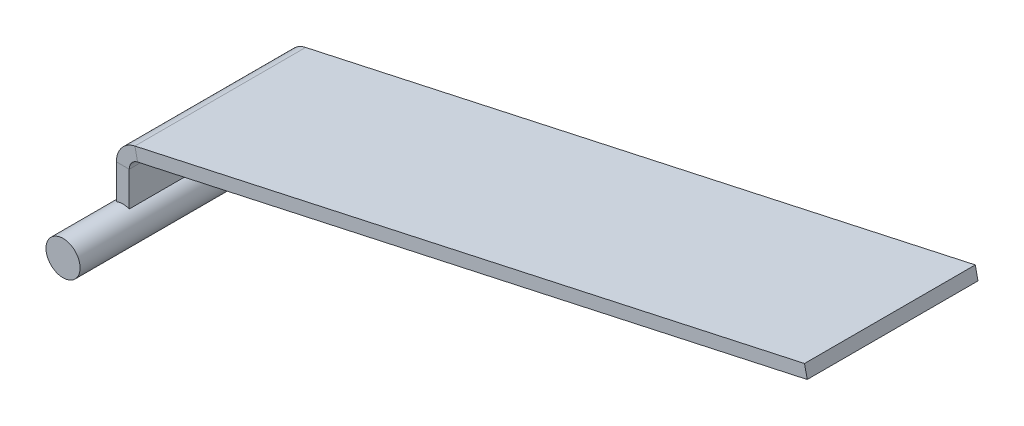
ISO-10303-21;
HEADER;
FILE_DESCRIPTION(('STEP AP214'),'2;1');
FILE_NAME('part.step','',(''),(''),'','','');
FILE_SCHEMA(('AUTOMOTIVE_DESIGN { 1 0 10303 214 1 1 1 1 }'));
ENDSEC;
DATA;
#1=APPLICATION_CONTEXT('core data for automotive mechanical design processes');
#2=APPLICATION_PROTOCOL_DEFINITION('international standard','automotive_design',2000,#1);
#3=PRODUCT_CONTEXT('',#1,'mechanical');
#4=PRODUCT('Part','Part','',(#3));
#5=PRODUCT_RELATED_PRODUCT_CATEGORY('part','',(#4));
#6=PRODUCT_DEFINITION_FORMATION('','',#4);
#7=PRODUCT_DEFINITION_CONTEXT('part definition',#1,'design');
#8=PRODUCT_DEFINITION('design','',#6,#7);
#9=PRODUCT_DEFINITION_SHAPE('','',#8);
#10=(LENGTH_UNIT() NAMED_UNIT(*) SI_UNIT(.MILLI.,.METRE.));
#11=(NAMED_UNIT(*) PLANE_ANGLE_UNIT() SI_UNIT($,.RADIAN.));
#12=(NAMED_UNIT(*) SI_UNIT($,.STERADIAN.) SOLID_ANGLE_UNIT());
#13=UNCERTAINTY_MEASURE_WITH_UNIT(LENGTH_MEASURE(1.E-05),#10,'distance_accuracy_value','');
#14=(GEOMETRIC_REPRESENTATION_CONTEXT(3) GLOBAL_UNCERTAINTY_ASSIGNED_CONTEXT((#13)) GLOBAL_UNIT_ASSIGNED_CONTEXT((#10,
#11,#12)) REPRESENTATION_CONTEXT('',''));
#15=CARTESIAN_POINT('',(0.,0.,0.));
#16=DIRECTION('',(0.,0.,1.));
#17=DIRECTION('',(1.,0.,0.));
#18=AXIS2_PLACEMENT_3D('',#15,#16,#17);
#19=CARTESIAN_POINT('',(-0.15,0.,-2.));
#20=DIRECTION('',(-1.,0.,0.));
#21=DIRECTION('',(0.,0.,1.));
#22=AXIS2_PLACEMENT_3D('',#19,#20,#21);
#23=PLANE('',#22);
#24=DIRECTION('',(0.,1.,0.));
#25=VECTOR('',#24,1.);
#26=CARTESIAN_POINT('',(-0.15,0.,-2.));
#27=LINE('',#26,#25);
#28=CARTESIAN_POINT('',(-0.15,0.370809924354783,-2.));
#29=VERTEX_POINT('',#28);
#30=CARTESIAN_POINT('',(-0.15,1.17804151614602,-2.));
#31=VERTEX_POINT('',#30);
#32=EDGE_CURVE('E200',#29,#31,#27,.T.);
#33=ORIENTED_EDGE('',*,*,#32,.F.);
#34=DIRECTION('',(0.,0.,-1.));
#35=VECTOR('',#34,1.);
#36=CARTESIAN_POINT('',(-0.15,0.370809924354783,3.4));
#37=LINE('',#36,#35);
#38=CARTESIAN_POINT('',(-0.15,0.370809924354783,2.));
#39=VERTEX_POINT('',#38);
#40=EDGE_CURVE('E54',#29,#39,#37,.F.);
#41=ORIENTED_EDGE('',*,*,#40,.T.);
#42=DIRECTION('',(0.,1.,0.));
#43=VECTOR('',#42,1.);
#44=CARTESIAN_POINT('',(-0.15,0.,2.));
#45=LINE('',#44,#43);
#46=CARTESIAN_POINT('',(-0.15,1.17804151614602,2.));
#47=VERTEX_POINT('',#46);
#48=EDGE_CURVE('E165',#39,#47,#45,.T.);
#49=ORIENTED_EDGE('',*,*,#48,.T.);
#50=DIRECTION('',(0.,0.,1.));
#51=VECTOR('',#50,1.);
#52=CARTESIAN_POINT('',(-0.15,1.17804151614602,-2.));
#53=LINE('',#52,#51);
#54=EDGE_CURVE('E196',#31,#47,#53,.T.);
#55=ORIENTED_EDGE('',*,*,#54,.F.);
#56=EDGE_LOOP('',(#33,#41,#49,#55));
#57=FACE_BOUND('',#56,.T.);
#58=ADVANCED_FACE('F39',(#57),#23,.T.);
#59=CARTESIAN_POINT('',(0.15,0.,-2.));
#60=DIRECTION('',(1.,0.,0.));
#61=DIRECTION('',(0.,0.,-1.));
#62=AXIS2_PLACEMENT_3D('',#59,#60,#61);
#63=PLANE('',#62);
#64=DIRECTION('',(0.,1.,0.));
#65=VECTOR('',#64,1.);
#66=CARTESIAN_POINT('',(0.15,0.,2.));
#67=LINE('',#66,#65);
#68=CARTESIAN_POINT('',(0.15,0.370809924354783,2.));
#69=VERTEX_POINT('',#68);
#70=CARTESIAN_POINT('',(0.15,1.17804151614602,2.));
#71=VERTEX_POINT('',#70);
#72=EDGE_CURVE('E114',#69,#71,#67,.T.);
#73=ORIENTED_EDGE('',*,*,#72,.F.);
#74=DIRECTION('',(0.,0.,-1.));
#75=VECTOR('',#74,1.);
#76=CARTESIAN_POINT('',(0.15,0.370809924354783,3.4));
#77=LINE('',#76,#75);
#78=CARTESIAN_POINT('',(0.15,0.370809924354783,-2.));
#79=VERTEX_POINT('',#78);
#80=EDGE_CURVE('E103',#69,#79,#77,.T.);
#81=ORIENTED_EDGE('',*,*,#80,.T.);
#82=DIRECTION('',(0.,1.,0.));
#83=VECTOR('',#82,1.);
#84=CARTESIAN_POINT('',(0.15,0.,-2.));
#85=LINE('',#84,#83);
#86=CARTESIAN_POINT('',(0.15,1.17804151614602,-2.));
#87=VERTEX_POINT('',#86);
#88=EDGE_CURVE('E112',#79,#87,#85,.T.);
#89=ORIENTED_EDGE('',*,*,#88,.T.);
#90=DIRECTION('',(0.,0.,-1.));
#91=VECTOR('',#90,1.);
#92=CARTESIAN_POINT('',(0.15,1.17804151614602,-2.));
#93=LINE('',#92,#91);
#94=EDGE_CURVE('E123',#71,#87,#93,.T.);
#95=ORIENTED_EDGE('',*,*,#94,.F.);
#96=EDGE_LOOP('',(#73,#81,#89,#95));
#97=FACE_BOUND('',#96,.T.);
#98=ADVANCED_FACE('F110',(#97),#63,.T.);
#99=CARTESIAN_POINT('',(16.,5.,0.));
#100=DIRECTION('',(0.976900017396262,0.213696878805432,0.));
#101=DIRECTION('',(0.,0.,1.));
#102=AXIS2_PLACEMENT_3D('',#99,#100,#101);
#103=PLANE('',#102);
#104=DIRECTION('',(0.,0.,-1.));
#105=VECTOR('',#104,1.);
#106=CARTESIAN_POINT('',(16.0320545318208,4.85346499739056,-2.));
#107=LINE('',#106,#105);
#108=CARTESIAN_POINT('',(16.0320545318208,4.85346499739056,2.));
#109=VERTEX_POINT('',#108);
#110=CARTESIAN_POINT('',(16.0320545318208,4.85346499739056,-2.));
#111=VERTEX_POINT('',#110);
#112=EDGE_CURVE('E61',#109,#111,#107,.T.);
#113=ORIENTED_EDGE('',*,*,#112,.T.);
#114=DIRECTION('',(-0.213696878805432,0.976900017396262,0.));
#115=VECTOR('',#114,1.);
#116=CARTESIAN_POINT('',(15.9679454681792,5.14653500260944,-2.));
#117=LINE('',#116,#115);
#118=CARTESIAN_POINT('',(15.9679454681792,5.14653500260944,-2.));
#119=VERTEX_POINT('',#118);
#120=EDGE_CURVE('E47',#111,#119,#117,.T.);
#121=ORIENTED_EDGE('',*,*,#120,.T.);
#122=DIRECTION('',(0.,0.,1.));
#123=VECTOR('',#122,1.);
#124=CARTESIAN_POINT('',(15.9679454681792,5.14653500260944,-2.));
#125=LINE('',#124,#123);
#126=CARTESIAN_POINT('',(15.9679454681792,5.14653500260944,2.));
#127=VERTEX_POINT('',#126);
#128=EDGE_CURVE('E146',#119,#127,#125,.T.);
#129=ORIENTED_EDGE('',*,*,#128,.T.);
#130=DIRECTION('',(0.213696878805432,-0.976900017396262,0.));
#131=VECTOR('',#130,1.);
#132=CARTESIAN_POINT('',(15.9679454681792,5.14653500260944,2.));
#133=LINE('',#132,#131);
#134=EDGE_CURVE('E173',#127,#109,#133,.T.);
#135=ORIENTED_EDGE('',*,*,#134,.T.);
#136=EDGE_LOOP('',(#113,#121,#129,#135));
#137=FACE_BOUND('',#136,.T.);
#138=ADVANCED_FACE('F41',(#137),#103,.T.);
#139=CARTESIAN_POINT('',(-0.15,0.,2.));
#140=DIRECTION('',(0.,0.,1.));
#141=DIRECTION('',(1.,0.,0.));
#142=AXIS2_PLACEMENT_3D('',#139,#140,#141);
#143=PLANE('',#142);
#144=ORIENTED_EDGE('',*,*,#48,.F.);
#145=CARTESIAN_POINT('',(0.,0.,2.));
#146=DIRECTION('',(0.,0.,1.));
#147=DIRECTION('',(1.,0.,0.));
#148=AXIS2_PLACEMENT_3D('',#145,#146,#147);
#149=CIRCLE('',#148,0.4);
#150=EDGE_CURVE('E115',#39,#69,#149,.F.);
#151=ORIENTED_EDGE('',*,*,#150,.T.);
#152=ORIENTED_EDGE('',*,*,#72,.T.);
#153=DIRECTION('',(1.,0.,0.));
#154=VECTOR('',#153,1.);
#155=CARTESIAN_POINT('',(-0.15,1.17804151614602,2.));
#156=LINE('',#155,#154);
#157=EDGE_CURVE('E162',#47,#71,#156,.T.);
#158=ORIENTED_EDGE('',*,*,#157,.F.);
#159=EDGE_LOOP('',(#144,#151,#152,#158));
#160=FACE_BOUND('',#159,.T.);
#161=ADVANCED_FACE('F192',(#160),#143,.T.);
#162=CARTESIAN_POINT('',(-0.15,0.,-2.));
#163=DIRECTION('',(0.,0.,-1.));
#164=DIRECTION('',(-1.,0.,0.));
#165=AXIS2_PLACEMENT_3D('',#162,#163,#164);
#166=PLANE('',#165);
#167=ORIENTED_EDGE('',*,*,#88,.F.);
#168=CARTESIAN_POINT('',(0.,0.,-2.));
#169=DIRECTION('',(0.,0.,-1.));
#170=DIRECTION('',(-1.,0.,0.));
#171=AXIS2_PLACEMENT_3D('',#168,#169,#170);
#172=CIRCLE('',#171,0.4);
#173=EDGE_CURVE('E11',#79,#29,#172,.F.);
#174=ORIENTED_EDGE('',*,*,#173,.T.);
#175=ORIENTED_EDGE('',*,*,#32,.T.);
#176=DIRECTION('',(-1.,0.,0.));
#177=VECTOR('',#176,1.);
#178=CARTESIAN_POINT('',(-0.15,1.17804151614602,-2.));
#179=LINE('',#178,#177);
#180=EDGE_CURVE('E121',#87,#31,#179,.T.);
#181=ORIENTED_EDGE('',*,*,#180,.F.);
#182=EDGE_LOOP('',(#167,#174,#175,#181));
#183=FACE_BOUND('',#182,.T.);
#184=ADVANCED_FACE('F119',(#183),#166,.T.);
#185=CARTESIAN_POINT('',(0.4,1.17804151614602,0.));
#186=DIRECTION('',(0.,0.,-1.));
#187=DIRECTION('',(-1.,0.,0.));
#188=AXIS2_PLACEMENT_3D('',#185,#186,#187);
#189=CYLINDRICAL_SURFACE('',#188,0.55);
#190=CARTESIAN_POINT('',(0.4,1.17804151614602,2.));
#191=DIRECTION('',(0.,0.,-1.));
#192=DIRECTION('',(-1.,0.,0.));
#193=AXIS2_PLACEMENT_3D('',#190,#191,#192);
#194=CIRCLE('',#193,0.55);
#195=CARTESIAN_POINT('',(0.282466716657016,1.71533652571396,2.));
#196=VERTEX_POINT('',#195);
#197=EDGE_CURVE('E170',#47,#196,#194,.T.);
#198=ORIENTED_EDGE('',*,*,#197,.T.);
#199=DIRECTION('',(0.,0.,1.));
#200=VECTOR('',#199,1.);
#201=CARTESIAN_POINT('',(0.282466716657016,1.71533652571396,-2.));
#202=LINE('',#201,#200);
#203=CARTESIAN_POINT('',(0.282466716657016,1.71533652571396,-2.));
#204=VERTEX_POINT('',#203);
#205=EDGE_CURVE('E207',#204,#196,#202,.T.);
#206=ORIENTED_EDGE('',*,*,#205,.F.);
#207=CARTESIAN_POINT('',(0.4,1.17804151614602,-2.));
#208=DIRECTION('',(0.,0.,-1.));
#209=DIRECTION('',(-1.,0.,0.));
#210=AXIS2_PLACEMENT_3D('',#207,#208,#209);
#211=CIRCLE('',#210,0.55);
#212=EDGE_CURVE('E125',#31,#204,#211,.T.);
#213=ORIENTED_EDGE('',*,*,#212,.F.);
#214=ORIENTED_EDGE('',*,*,#54,.T.);
#215=EDGE_LOOP('',(#198,#206,#213,#214));
#216=FACE_BOUND('',#215,.T.);
#217=ADVANCED_FACE('F197',(#216),#189,.T.);
#218=CARTESIAN_POINT('',(-0.15,1.17804151614602,2.));
#219=DIRECTION('',(0.,0.,1.));
#220=DIRECTION('',(1.,0.,0.));
#221=AXIS2_PLACEMENT_3D('',#218,#219,#220);
#222=PLANE('',#221);
#223=CARTESIAN_POINT('',(0.4,1.17804151614602,2.));
#224=DIRECTION('',(0.,0.,-1.));
#225=DIRECTION('',(-1.,0.,0.));
#226=AXIS2_PLACEMENT_3D('',#223,#224,#225);
#227=CIRCLE('',#226,0.25);
#228=CARTESIAN_POINT('',(0.346575780298644,1.42226652049509,2.));
#229=VERTEX_POINT('',#228);
#230=EDGE_CURVE('E134',#71,#229,#227,.T.);
#231=ORIENTED_EDGE('',*,*,#230,.T.);
#232=DIRECTION('',(0.213696878805426,-0.976900017396263,0.));
#233=VECTOR('',#232,1.);
#234=CARTESIAN_POINT('',(0.282466716657016,1.71533652571396,2.));
#235=LINE('',#234,#233);
#236=EDGE_CURVE('E167',#196,#229,#235,.T.);
#237=ORIENTED_EDGE('',*,*,#236,.F.);
#238=ORIENTED_EDGE('',*,*,#197,.F.);
#239=ORIENTED_EDGE('',*,*,#157,.T.);
#240=EDGE_LOOP('',(#231,#237,#238,#239));
#241=FACE_BOUND('',#240,.T.);
#242=ADVANCED_FACE('F185',(#241),#222,.T.);
#243=CARTESIAN_POINT('',(0.4,1.17804151614602,0.));
#244=DIRECTION('',(0.,0.,-1.));
#245=DIRECTION('',(-1.,0.,0.));
#246=AXIS2_PLACEMENT_3D('',#243,#244,#245);
#247=CYLINDRICAL_SURFACE('',#246,0.25);
#248=CARTESIAN_POINT('',(0.4,1.17804151614602,-2.));
#249=DIRECTION('',(0.,0.,-1.));
#250=DIRECTION('',(-1.,0.,0.));
#251=AXIS2_PLACEMENT_3D('',#248,#249,#250);
#252=CIRCLE('',#251,0.25);
#253=CARTESIAN_POINT('',(0.346575780298643,1.42226652049509,-2.));
#254=VERTEX_POINT('',#253);
#255=EDGE_CURVE('E133',#87,#254,#252,.T.);
#256=ORIENTED_EDGE('',*,*,#255,.T.);
#257=DIRECTION('',(0.,0.,-1.));
#258=VECTOR('',#257,1.);
#259=CARTESIAN_POINT('',(0.346575780298643,1.42226652049509,-2.));
#260=LINE('',#259,#258);
#261=EDGE_CURVE('E130',#229,#254,#260,.T.);
#262=ORIENTED_EDGE('',*,*,#261,.F.);
#263=ORIENTED_EDGE('',*,*,#230,.F.);
#264=ORIENTED_EDGE('',*,*,#94,.T.);
#265=EDGE_LOOP('',(#256,#262,#263,#264));
#266=FACE_BOUND('',#265,.T.);
#267=ADVANCED_FACE('F183',(#266),#247,.F.);
#268=CARTESIAN_POINT('',(-0.15,1.17804151614602,-2.));
#269=DIRECTION('',(0.,0.,-1.));
#270=DIRECTION('',(-1.,0.,0.));
#271=AXIS2_PLACEMENT_3D('',#268,#269,#270);
#272=PLANE('',#271);
#273=DIRECTION('',(-0.213696878805426,0.976900017396263,0.));
#274=VECTOR('',#273,1.);
#275=CARTESIAN_POINT('',(0.282466716657016,1.71533652571396,-2.));
#276=LINE('',#275,#274);
#277=EDGE_CURVE('E137',#254,#204,#276,.T.);
#278=ORIENTED_EDGE('',*,*,#277,.F.);
#279=ORIENTED_EDGE('',*,*,#255,.F.);
#280=ORIENTED_EDGE('',*,*,#180,.T.);
#281=ORIENTED_EDGE('',*,*,#212,.T.);
#282=EDGE_LOOP('',(#278,#279,#280,#281));
#283=FACE_BOUND('',#282,.T.);
#284=ADVANCED_FACE('F211',(#283),#272,.T.);
#285=CARTESIAN_POINT('',(0.282466716657015,1.71533652571396,-2.));
#286=DIRECTION('',(-0.213696878805432,0.976900017396262,0.));
#287=DIRECTION('',(-0.976900017396262,-0.213696878805432,0.));
#288=AXIS2_PLACEMENT_3D('',#285,#286,#287);
#289=PLANE('',#288);
#290=DIRECTION('',(0.976900017396262,0.213696878805432,0.));
#291=VECTOR('',#290,1.);
#292=CARTESIAN_POINT('',(0.282466716657015,1.71533652571396,2.));
#293=LINE('',#292,#291);
#294=EDGE_CURVE('E154',#196,#127,#293,.T.);
#295=ORIENTED_EDGE('',*,*,#294,.T.);
#296=ORIENTED_EDGE('',*,*,#128,.F.);
#297=DIRECTION('',(0.976900017396262,0.213696878805432,0.));
#298=VECTOR('',#297,1.);
#299=CARTESIAN_POINT('',(0.282466716657015,1.71533652571396,-2.));
#300=LINE('',#299,#298);
#301=EDGE_CURVE('E144',#204,#119,#300,.T.);
#302=ORIENTED_EDGE('',*,*,#301,.F.);
#303=ORIENTED_EDGE('',*,*,#205,.T.);
#304=EDGE_LOOP('',(#295,#296,#302,#303));
#305=FACE_BOUND('',#304,.T.);
#306=ADVANCED_FACE('F152',(#305),#289,.T.);
#307=CARTESIAN_POINT('',(0.282466716657015,1.71533652571396,2.));
#308=DIRECTION('',(0.,0.,1.));
#309=DIRECTION('',(1.,0.,0.));
#310=AXIS2_PLACEMENT_3D('',#307,#308,#309);
#311=PLANE('',#310);
#312=DIRECTION('',(0.976900017396262,0.213696878805432,0.));
#313=VECTOR('',#312,1.);
#314=CARTESIAN_POINT('',(0.346575780298644,1.42226652049509,2.));
#315=LINE('',#314,#313);
#316=EDGE_CURVE('E140',#229,#109,#315,.T.);
#317=ORIENTED_EDGE('',*,*,#316,.T.);
#318=ORIENTED_EDGE('',*,*,#134,.F.);
#319=ORIENTED_EDGE('',*,*,#294,.F.);
#320=ORIENTED_EDGE('',*,*,#236,.T.);
#321=EDGE_LOOP('',(#317,#318,#319,#320));
#322=FACE_BOUND('',#321,.T.);
#323=ADVANCED_FACE('F176',(#322),#311,.T.);
#324=CARTESIAN_POINT('',(0.346575780298644,1.42226652049509,-2.));
#325=DIRECTION('',(0.213696878805432,-0.976900017396262,0.));
#326=DIRECTION('',(0.976900017396262,0.213696878805432,0.));
#327=AXIS2_PLACEMENT_3D('',#324,#325,#326);
#328=PLANE('',#327);
#329=DIRECTION('',(0.976900017396262,0.213696878805432,0.));
#330=VECTOR('',#329,1.);
#331=CARTESIAN_POINT('',(0.346575780298644,1.42226652049509,-2.));
#332=LINE('',#331,#330);
#333=EDGE_CURVE('E139',#254,#111,#332,.T.);
#334=ORIENTED_EDGE('',*,*,#333,.T.);
#335=ORIENTED_EDGE('',*,*,#112,.F.);
#336=ORIENTED_EDGE('',*,*,#316,.F.);
#337=ORIENTED_EDGE('',*,*,#261,.T.);
#338=EDGE_LOOP('',(#334,#335,#336,#337));
#339=FACE_BOUND('',#338,.T.);
#340=ADVANCED_FACE('F180',(#339),#328,.T.);
#341=CARTESIAN_POINT('',(0.282466716657015,1.71533652571396,-2.));
#342=DIRECTION('',(0.,0.,-1.));
#343=DIRECTION('',(-1.,0.,0.));
#344=AXIS2_PLACEMENT_3D('',#341,#342,#343);
#345=PLANE('',#344);
#346=ORIENTED_EDGE('',*,*,#120,.F.);
#347=ORIENTED_EDGE('',*,*,#333,.F.);
#348=ORIENTED_EDGE('',*,*,#277,.T.);
#349=ORIENTED_EDGE('',*,*,#301,.T.);
#350=EDGE_LOOP('',(#346,#347,#348,#349));
#351=FACE_BOUND('',#350,.T.);
#352=ADVANCED_FACE('F156',(#351),#345,.T.);
#353=CARTESIAN_POINT('',(0.,0.,3.4));
#354=DIRECTION('',(0.,0.,-1.));
#355=DIRECTION('',(-1.,0.,0.));
#356=AXIS2_PLACEMENT_3D('',#353,#354,#355);
#357=CYLINDRICAL_SURFACE('',#356,0.4);
#358=ORIENTED_EDGE('',*,*,#40,.F.);
#359=ORIENTED_EDGE('',*,*,#173,.F.);
#360=ORIENTED_EDGE('',*,*,#80,.F.);
#361=ORIENTED_EDGE('',*,*,#150,.F.);
#362=EDGE_LOOP('',(#358,#359,#360,#361));
#363=FACE_BOUND('',#362,.T.);
#364=CARTESIAN_POINT('',(0.,0.,3.4));
#365=DIRECTION('',(0.,0.,1.));
#366=DIRECTION('',(1.,0.,0.));
#367=AXIS2_PLACEMENT_3D('',#364,#365,#366);
#368=CIRCLE('',#367,0.4);
#369=CARTESIAN_POINT('',(0.4,0.,3.4));
#370=VERTEX_POINT('',#369);
#371=EDGE_CURVE('E116',#370,#370,#368,.T.);
#372=ORIENTED_EDGE('',*,*,#371,.F.);
#373=EDGE_LOOP('',(#372));
#374=FACE_BOUND('',#373,.T.);
#375=CARTESIAN_POINT('',(0.,0.,-3.4));
#376=DIRECTION('',(0.,0.,1.));
#377=DIRECTION('',(1.,0.,0.));
#378=AXIS2_PLACEMENT_3D('',#375,#376,#377);
#379=CIRCLE('',#378,0.4);
#380=CARTESIAN_POINT('',(0.4,0.,-3.4));
#381=VERTEX_POINT('',#380);
#382=EDGE_CURVE('E270',#381,#381,#379,.T.);
#383=ORIENTED_EDGE('',*,*,#382,.T.);
#384=EDGE_LOOP('',(#383));
#385=FACE_BOUND('',#384,.T.);
#386=ADVANCED_FACE('F101',(#363,#374,#385),#357,.T.);
#387=CARTESIAN_POINT('',(0.,0.,3.4));
#388=DIRECTION('',(0.,0.,1.));
#389=DIRECTION('',(1.,0.,0.));
#390=AXIS2_PLACEMENT_3D('',#387,#388,#389);
#391=PLANE('',#390);
#392=ORIENTED_EDGE('',*,*,#371,.T.);
#393=EDGE_LOOP('',(#392));
#394=FACE_BOUND('',#393,.T.);
#395=ADVANCED_FACE('F252',(#394),#391,.T.);
#396=CARTESIAN_POINT('',(0.,0.,-3.4));
#397=DIRECTION('',(0.,0.,1.));
#398=DIRECTION('',(1.,0.,0.));
#399=AXIS2_PLACEMENT_3D('',#396,#397,#398);
#400=PLANE('',#399);
#401=ORIENTED_EDGE('',*,*,#382,.F.);
#402=EDGE_LOOP('',(#401));
#403=FACE_BOUND('',#402,.T.);
#404=ADVANCED_FACE('F258',(#403),#400,.F.);
#405=CLOSED_SHELL('',(#58,#98,#138,#161,#184,#217,#242,#267,#284,#306,#323,#340,#352,#386,#395,#404));
#406=MANIFOLD_SOLID_BREP('B2',#405);
#407=ADVANCED_BREP_SHAPE_REPRESENTATION('',(#18,#406),#14);
#408=SHAPE_DEFINITION_REPRESENTATION(#9,#407);
ENDSEC;
END-ISO-10303-21;
